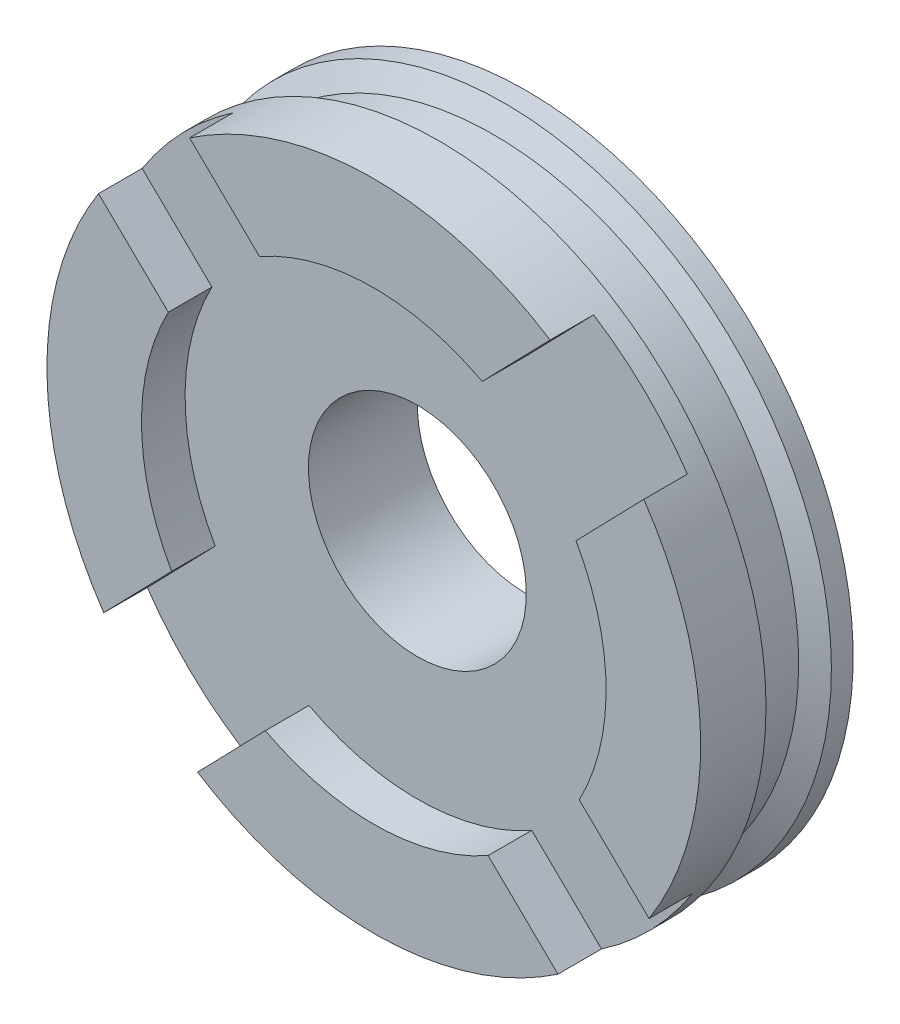
ISO-10303-21;
HEADER;
FILE_DESCRIPTION(('STEP AP214'),'2;1');
FILE_NAME('part.step','',(''),(''),'','','');
FILE_SCHEMA(('AUTOMOTIVE_DESIGN { 1 0 10303 214 1 1 1 1 }'));
ENDSEC;
DATA;
#1=APPLICATION_CONTEXT('core data for automotive mechanical design processes');
#2=APPLICATION_PROTOCOL_DEFINITION('international standard','automotive_design',2000,#1);
#3=PRODUCT_CONTEXT('',#1,'mechanical');
#4=PRODUCT('Part','Part','',(#3));
#5=PRODUCT_RELATED_PRODUCT_CATEGORY('part','',(#4));
#6=PRODUCT_DEFINITION_FORMATION('','',#4);
#7=PRODUCT_DEFINITION_CONTEXT('part definition',#1,'design');
#8=PRODUCT_DEFINITION('design','',#6,#7);
#9=PRODUCT_DEFINITION_SHAPE('','',#8);
#10=(LENGTH_UNIT() NAMED_UNIT(*) SI_UNIT(.MILLI.,.METRE.));
#11=(NAMED_UNIT(*) PLANE_ANGLE_UNIT() SI_UNIT($,.RADIAN.));
#12=(NAMED_UNIT(*) SI_UNIT($,.STERADIAN.) SOLID_ANGLE_UNIT());
#13=UNCERTAINTY_MEASURE_WITH_UNIT(LENGTH_MEASURE(1.E-05),#10,'distance_accuracy_value','');
#14=(GEOMETRIC_REPRESENTATION_CONTEXT(3) GLOBAL_UNCERTAINTY_ASSIGNED_CONTEXT((#13)) GLOBAL_UNIT_ASSIGNED_CONTEXT((#10,
#11,#12)) REPRESENTATION_CONTEXT('',''));
#15=CARTESIAN_POINT('',(0.,0.,0.));
#16=DIRECTION('',(0.,0.,1.));
#17=DIRECTION('',(1.,0.,0.));
#18=AXIS2_PLACEMENT_3D('',#15,#16,#17);
#19=CARTESIAN_POINT('',(60.,0.,20.));
#20=DIRECTION('',(0.,0.,1.));
#21=DIRECTION('',(0.717265531340079,-0.696799940837709,0.));
#22=AXIS2_PLACEMENT_3D('',#19,#20,#21);
#23=PLANE('',#22);
#24=CARTESIAN_POINT('',(60.,0.,20.));
#25=DIRECTION('',(0.,0.,1.));
#26=DIRECTION('',(0.717265531340079,-0.696799940837709,0.));
#27=AXIS2_PLACEMENT_3D('',#24,#25,#26);
#28=CIRCLE('',#27,5.);
#29=CARTESIAN_POINT('',(63.5863276567004,-3.48399970418854,20.));
#30=VERTEX_POINT('',#29);
#31=EDGE_CURVE('E280',#30,#30,#28,.T.);
#32=ORIENTED_EDGE('',*,*,#31,.F.);
#33=EDGE_LOOP('',(#32));
#34=FACE_BOUND('',#33,.T.);
#35=CARTESIAN_POINT('',(60.,0.,20.));
#36=DIRECTION('',(0.,0.,-1.));
#37=DIRECTION('',(0.717265531340079,-0.696799940837709,0.));
#38=AXIS2_PLACEMENT_3D('',#35,#36,#37);
#39=CIRCLE('',#38,10.6610669594002);
#40=CARTESIAN_POINT('',(50.7197544484852,-5.2474175759514,20.));
#41=VERTEX_POINT('',#40);
#42=CARTESIAN_POINT('',(50.5717827790223,4.97665236347435,20.));
#43=VERTEX_POINT('',#42);
#44=EDGE_CURVE('E55',#41,#43,#39,.T.);
#45=ORIENTED_EDGE('',*,*,#44,.F.);
#46=DIRECTION('',(0.696799940837709,0.717265531340079,0.));
#47=VECTOR('',#46,1.);
#48=CARTESIAN_POINT('',(47.6073775588564,-8.45120754870358,20.));
#49=LINE('',#48,#47);
#50=CARTESIAN_POINT('',(47.6073775588564,-8.45120754870358,20.));
#51=VERTEX_POINT('',#50);
#52=EDGE_CURVE('E321',#51,#41,#49,.T.);
#53=ORIENTED_EDGE('',*,*,#52,.F.);
#54=CARTESIAN_POINT('',(60.,0.,20.));
#55=DIRECTION('',(0.,0.,1.));
#56=DIRECTION('',(0.717265531340079,-0.696799940837709,0.));
#57=AXIS2_PLACEMENT_3D('',#54,#55,#56);
#58=CIRCLE('',#57,15.);
#59=CARTESIAN_POINT('',(51.9109707468969,-12.6320071937298,20.));
#60=VERTEX_POINT('',#59);
#61=EDGE_CURVE('E47',#51,#60,#58,.T.);
#62=ORIENTED_EDGE('',*,*,#61,.T.);
#63=DIRECTION('',(-0.696799940837709,-0.717265531340079,0.));
#64=VECTOR('',#63,1.);
#65=CARTESIAN_POINT('',(51.9109707468969,-12.6320071937298,20.));
#66=LINE('',#65,#64);
#67=CARTESIAN_POINT('',(55.0233476365256,-9.42821722097766,20.));
#68=VERTEX_POINT('',#67);
#69=EDGE_CURVE('E186',#68,#60,#66,.T.);
#70=ORIENTED_EDGE('',*,*,#69,.F.);
#71=CARTESIAN_POINT('',(60.,0.,20.));
#72=DIRECTION('',(0.,0.,-1.));
#73=DIRECTION('',(0.717265531340079,-0.696799940837709,0.));
#74=AXIS2_PLACEMENT_3D('',#71,#72,#73);
#75=CIRCLE('',#74,10.6610669594002);
#76=CARTESIAN_POINT('',(65.2474175759514,-9.28024555151483,20.));
#77=VERTEX_POINT('',#76);
#78=EDGE_CURVE('E176',#77,#68,#75,.T.);
#79=ORIENTED_EDGE('',*,*,#78,.F.);
#80=DIRECTION('',(-0.717265531340079,0.696799940837709,0.));
#81=VECTOR('',#80,1.);
#82=CARTESIAN_POINT('',(68.4512075487036,-12.3926224411436,20.));
#83=LINE('',#82,#81);
#84=CARTESIAN_POINT('',(68.4512075487036,-12.3926224411436,20.));
#85=VERTEX_POINT('',#84);
#86=EDGE_CURVE('E173',#85,#77,#83,.T.);
#87=ORIENTED_EDGE('',*,*,#86,.F.);
#88=CARTESIAN_POINT('',(72.6320071937298,-8.08902925310312,20.));
#89=VERTEX_POINT('',#88);
#90=EDGE_CURVE('E318',#85,#89,#58,.T.);
#91=ORIENTED_EDGE('',*,*,#90,.T.);
#92=DIRECTION('',(0.717265531340079,-0.696799940837709,0.));
#93=VECTOR('',#92,1.);
#94=CARTESIAN_POINT('',(72.6320071937298,-8.08902925310312,20.));
#95=LINE('',#94,#93);
#96=CARTESIAN_POINT('',(69.4282172209777,-4.97665236347436,20.));
#97=VERTEX_POINT('',#96);
#98=EDGE_CURVE('E212',#97,#89,#95,.T.);
#99=ORIENTED_EDGE('',*,*,#98,.F.);
#100=CARTESIAN_POINT('',(60.,0.,20.));
#101=DIRECTION('',(0.,0.,-1.));
#102=DIRECTION('',(0.717265531340079,-0.696799940837709,0.));
#103=AXIS2_PLACEMENT_3D('',#100,#101,#102);
#104=CIRCLE('',#103,10.6610669594002);
#105=CARTESIAN_POINT('',(69.2802455515148,5.2474175759514,20.));
#106=VERTEX_POINT('',#105);
#107=EDGE_CURVE('E221',#106,#97,#104,.T.);
#108=ORIENTED_EDGE('',*,*,#107,.F.);
#109=DIRECTION('',(-0.696799940837709,-0.717265531340079,0.));
#110=VECTOR('',#109,1.);
#111=CARTESIAN_POINT('',(72.3926224411436,8.45120754870358,20.));
#112=LINE('',#111,#110);
#113=CARTESIAN_POINT('',(72.3926224411436,8.45120754870358,20.));
#114=VERTEX_POINT('',#113);
#115=EDGE_CURVE('E207',#114,#106,#112,.T.);
#116=ORIENTED_EDGE('',*,*,#115,.F.);
#117=CARTESIAN_POINT('',(68.0890292531031,12.6320071937298,20.));
#118=VERTEX_POINT('',#117);
#119=EDGE_CURVE('E48',#114,#118,#58,.T.);
#120=ORIENTED_EDGE('',*,*,#119,.T.);
#121=DIRECTION('',(0.696799940837709,0.717265531340079,0.));
#122=VECTOR('',#121,1.);
#123=CARTESIAN_POINT('',(68.0890292531031,12.6320071937298,20.));
#124=LINE('',#123,#122);
#125=CARTESIAN_POINT('',(64.9766523634744,9.42821722097765,20.));
#126=VERTEX_POINT('',#125);
#127=EDGE_CURVE('E242',#126,#118,#124,.T.);
#128=ORIENTED_EDGE('',*,*,#127,.F.);
#129=CARTESIAN_POINT('',(60.,0.,20.));
#130=DIRECTION('',(0.,0.,-1.));
#131=DIRECTION('',(0.717265531340079,-0.696799940837709,0.));
#132=AXIS2_PLACEMENT_3D('',#129,#130,#131);
#133=CIRCLE('',#132,10.6610669594002);
#134=CARTESIAN_POINT('',(54.7525824240486,9.28024555151483,20.));
#135=VERTEX_POINT('',#134);
#136=EDGE_CURVE('E251',#135,#126,#133,.T.);
#137=ORIENTED_EDGE('',*,*,#136,.F.);
#138=DIRECTION('',(0.717265531340079,-0.696799940837709,0.));
#139=VECTOR('',#138,1.);
#140=CARTESIAN_POINT('',(51.5487924512964,12.3926224411436,20.));
#141=LINE('',#140,#139);
#142=CARTESIAN_POINT('',(51.5487924512964,12.3926224411436,20.));
#143=VERTEX_POINT('',#142);
#144=EDGE_CURVE('E237',#143,#135,#141,.T.);
#145=ORIENTED_EDGE('',*,*,#144,.F.);
#146=CARTESIAN_POINT('',(47.3679928062702,8.08902925310312,20.));
#147=VERTEX_POINT('',#146);
#148=EDGE_CURVE('E11',#143,#147,#58,.T.);
#149=ORIENTED_EDGE('',*,*,#148,.T.);
#150=DIRECTION('',(-0.717265531340079,0.696799940837708,0.));
#151=VECTOR('',#150,1.);
#152=CARTESIAN_POINT('',(47.3679928062702,8.08902925310312,20.));
#153=LINE('',#152,#151);
#154=EDGE_CURVE('E59',#43,#147,#153,.T.);
#155=ORIENTED_EDGE('',*,*,#154,.F.);
#156=EDGE_LOOP('',(#45,#53,#62,#70,#79,#87,#91,#99,#108,#116,#120,#128,#137,#145,#149,#155));
#157=FACE_BOUND('',#156,.T.);
#158=ADVANCED_FACE('F38',(#34,#157),#23,.T.);
#159=CARTESIAN_POINT('',(60.,0.,20.));
#160=DIRECTION('',(0.,0.,-1.));
#161=DIRECTION('',(-0.717265531340079,0.696799940837709,0.));
#162=AXIS2_PLACEMENT_3D('',#159,#160,#161);
#163=CYLINDRICAL_SURFACE('',#162,15.);
#164=CARTESIAN_POINT('',(60.,0.,16.));
#165=DIRECTION('',(0.,0.,-1.));
#166=DIRECTION('',(-0.717265531340079,0.696799940837709,0.));
#167=AXIS2_PLACEMENT_3D('',#164,#165,#166);
#168=CIRCLE('',#167,15.);
#169=CARTESIAN_POINT('',(49.2410170298988,10.4519991125656,16.));
#170=VERTEX_POINT('',#169);
#171=EDGE_CURVE('E276',#170,#170,#168,.T.);
#172=ORIENTED_EDGE('',*,*,#171,.T.);
#173=EDGE_LOOP('',(#172));
#174=FACE_BOUND('',#173,.T.);
#175=CARTESIAN_POINT('',(60.,0.,15.));
#176=DIRECTION('',(0.,0.,1.));
#177=DIRECTION('',(0.717265531340079,-0.696799940837709,0.));
#178=AXIS2_PLACEMENT_3D('',#175,#176,#177);
#179=CIRCLE('',#178,15.);
#180=CARTESIAN_POINT('',(70.7589829701012,-10.4519991125656,15.));
#181=VERTEX_POINT('',#180);
#182=EDGE_CURVE('E42',#181,#181,#179,.T.);
#183=ORIENTED_EDGE('',*,*,#182,.T.);
#184=EDGE_LOOP('',(#183));
#185=FACE_BOUND('',#184,.T.);
#186=ADVANCED_FACE('F301',(#174,#185),#163,.T.);
#187=CARTESIAN_POINT('',(60.,0.,15.));
#188=DIRECTION('',(0.,0.,1.));
#189=DIRECTION('',(0.717265531340079,-0.696799940837709,0.));
#190=AXIS2_PLACEMENT_3D('',#187,#188,#189);
#191=PLANE('',#190);
#192=ORIENTED_EDGE('',*,*,#182,.F.);
#193=EDGE_LOOP('',(#192));
#194=FACE_BOUND('',#193,.T.);
#195=CARTESIAN_POINT('',(60.,0.,15.));
#196=DIRECTION('',(0.,0.,1.));
#197=DIRECTION('',(0.717265531340079,-0.696799940837709,0.));
#198=AXIS2_PLACEMENT_3D('',#195,#196,#197);
#199=CIRCLE('',#198,5.);
#200=CARTESIAN_POINT('',(63.5863276567004,-3.48399970418854,15.));
#201=VERTEX_POINT('',#200);
#202=EDGE_CURVE('E279',#201,#201,#199,.T.);
#203=ORIENTED_EDGE('',*,*,#202,.T.);
#204=EDGE_LOOP('',(#203));
#205=FACE_BOUND('',#204,.T.);
#206=ADVANCED_FACE('F286',(#194,#205),#191,.F.);
#207=CARTESIAN_POINT('',(60.,0.,19.));
#208=DIRECTION('',(0.,0.,-1.));
#209=DIRECTION('',(-0.717265531340079,0.696799940837709,0.));
#210=AXIS2_PLACEMENT_3D('',#207,#208,#209);
#211=CIRCLE('',#210,15.);
#212=CARTESIAN_POINT('',(49.2410170298988,10.4519991125656,19.));
#213=VERTEX_POINT('',#212);
#214=EDGE_CURVE('E267',#213,#213,#211,.T.);
#215=ORIENTED_EDGE('',*,*,#214,.F.);
#216=EDGE_LOOP('',(#215));
#217=FACE_BOUND('',#216,.T.);
#218=ORIENTED_EDGE('',*,*,#148,.F.);
#219=DIRECTION('',(0.,0.,-1.));
#220=VECTOR('',#219,1.);
#221=CARTESIAN_POINT('',(51.5487924512964,12.3926224411436,22.));
#222=LINE('',#221,#220);
#223=CARTESIAN_POINT('',(51.5487924512964,12.3926224411436,22.));
#224=VERTEX_POINT('',#223);
#225=EDGE_CURVE('E264',#224,#143,#222,.T.);
#226=ORIENTED_EDGE('',*,*,#225,.F.);
#227=CARTESIAN_POINT('',(60.,0.,22.));
#228=DIRECTION('',(0.,0.,1.));
#229=DIRECTION('',(0.717265531340079,-0.696799940837709,0.));
#230=AXIS2_PLACEMENT_3D('',#227,#228,#229);
#231=CIRCLE('',#230,15.);
#232=CARTESIAN_POINT('',(68.0890292531031,12.6320071937298,22.));
#233=VERTEX_POINT('',#232);
#234=EDGE_CURVE('E238',#233,#224,#231,.T.);
#235=ORIENTED_EDGE('',*,*,#234,.F.);
#236=DIRECTION('',(0.,0.,-1.));
#237=VECTOR('',#236,1.);
#238=CARTESIAN_POINT('',(68.0890292531031,12.6320071937298,22.));
#239=LINE('',#238,#237);
#240=EDGE_CURVE('E248',#233,#118,#239,.T.);
#241=ORIENTED_EDGE('',*,*,#240,.T.);
#242=ORIENTED_EDGE('',*,*,#119,.F.);
#243=DIRECTION('',(0.,0.,-1.));
#244=VECTOR('',#243,1.);
#245=CARTESIAN_POINT('',(72.3926224411436,8.45120754870358,22.));
#246=LINE('',#245,#244);
#247=CARTESIAN_POINT('',(72.3926224411436,8.45120754870358,22.));
#248=VERTEX_POINT('',#247);
#249=EDGE_CURVE('E234',#248,#114,#246,.T.);
#250=ORIENTED_EDGE('',*,*,#249,.F.);
#251=CARTESIAN_POINT('',(60.,0.,22.));
#252=DIRECTION('',(0.,0.,1.));
#253=DIRECTION('',(0.717265531340079,-0.696799940837709,0.));
#254=AXIS2_PLACEMENT_3D('',#251,#252,#253);
#255=CIRCLE('',#254,15.);
#256=CARTESIAN_POINT('',(72.6320071937298,-8.08902925310312,22.));
#257=VERTEX_POINT('',#256);
#258=EDGE_CURVE('E208',#257,#248,#255,.T.);
#259=ORIENTED_EDGE('',*,*,#258,.F.);
#260=DIRECTION('',(0.,0.,-1.));
#261=VECTOR('',#260,1.);
#262=CARTESIAN_POINT('',(72.6320071937298,-8.08902925310312,22.));
#263=LINE('',#262,#261);
#264=EDGE_CURVE('E218',#257,#89,#263,.T.);
#265=ORIENTED_EDGE('',*,*,#264,.T.);
#266=ORIENTED_EDGE('',*,*,#90,.F.);
#267=DIRECTION('',(0.,0.,-1.));
#268=VECTOR('',#267,1.);
#269=CARTESIAN_POINT('',(68.4512075487036,-12.3926224411436,22.));
#270=LINE('',#269,#268);
#271=CARTESIAN_POINT('',(68.4512075487036,-12.3926224411436,22.));
#272=VERTEX_POINT('',#271);
#273=EDGE_CURVE('E204',#272,#85,#270,.T.);
#274=ORIENTED_EDGE('',*,*,#273,.F.);
#275=CARTESIAN_POINT('',(60.,0.,22.));
#276=DIRECTION('',(0.,0.,1.));
#277=DIRECTION('',(0.717265531340079,-0.696799940837709,0.));
#278=AXIS2_PLACEMENT_3D('',#275,#276,#277);
#279=CIRCLE('',#278,15.);
#280=CARTESIAN_POINT('',(51.9109707468969,-12.6320071937298,22.));
#281=VERTEX_POINT('',#280);
#282=EDGE_CURVE('E182',#281,#272,#279,.T.);
#283=ORIENTED_EDGE('',*,*,#282,.F.);
#284=DIRECTION('',(0.,0.,-1.));
#285=VECTOR('',#284,1.);
#286=CARTESIAN_POINT('',(51.9109707468969,-12.6320071937298,22.));
#287=LINE('',#286,#285);
#288=EDGE_CURVE('E191',#281,#60,#287,.T.);
#289=ORIENTED_EDGE('',*,*,#288,.T.);
#290=ORIENTED_EDGE('',*,*,#61,.F.);
#291=DIRECTION('',(0.,0.,-1.));
#292=VECTOR('',#291,1.);
#293=CARTESIAN_POINT('',(47.6073775588564,-8.45120754870358,22.));
#294=LINE('',#293,#292);
#295=CARTESIAN_POINT('',(47.6073775588564,-8.45120754870358,22.));
#296=VERTEX_POINT('',#295);
#297=EDGE_CURVE('E155',#296,#51,#294,.T.);
#298=ORIENTED_EDGE('',*,*,#297,.F.);
#299=CARTESIAN_POINT('',(60.,0.,22.));
#300=DIRECTION('',(0.,0.,1.));
#301=DIRECTION('',(0.717265531340079,-0.696799940837709,0.));
#302=AXIS2_PLACEMENT_3D('',#299,#300,#301);
#303=CIRCLE('',#302,15.);
#304=CARTESIAN_POINT('',(47.3679928062702,8.08902925310312,22.));
#305=VERTEX_POINT('',#304);
#306=EDGE_CURVE('E161',#305,#296,#303,.T.);
#307=ORIENTED_EDGE('',*,*,#306,.F.);
#308=DIRECTION('',(0.,0.,-1.));
#309=VECTOR('',#308,1.);
#310=CARTESIAN_POINT('',(47.3679928062702,8.08902925310312,22.));
#311=LINE('',#310,#309);
#312=EDGE_CURVE('E588',#305,#147,#311,.T.);
#313=ORIENTED_EDGE('',*,*,#312,.T.);
#314=EDGE_LOOP('',(#218,#226,#235,#241,#242,#250,#259,#265,#266,#274,#283,#289,#290,#298,#307,#313));
#315=FACE_BOUND('',#314,.T.);
#316=ADVANCED_FACE('F40',(#217,#315),#163,.T.);
#317=CARTESIAN_POINT('',(60.,0.,20.));
#318=DIRECTION('',(0.,0.,-1.));
#319=DIRECTION('',(-0.717265531340079,0.696799940837709,0.));
#320=AXIS2_PLACEMENT_3D('',#317,#318,#319);
#321=CYLINDRICAL_SURFACE('',#320,5.);
#322=ORIENTED_EDGE('',*,*,#31,.T.);
#323=EDGE_LOOP('',(#322));
#324=FACE_BOUND('',#323,.T.);
#325=ORIENTED_EDGE('',*,*,#202,.F.);
#326=EDGE_LOOP('',(#325));
#327=FACE_BOUND('',#326,.T.);
#328=ADVANCED_FACE('F288',(#324,#327),#321,.F.);
#329=CARTESIAN_POINT('',(60.,0.,16.5));
#330=DIRECTION('',(0.,0.,-1.));
#331=DIRECTION('',(-0.717265531340079,0.696799940837709,0.));
#332=AXIS2_PLACEMENT_3D('',#329,#330,#331);
#333=CONICAL_SURFACE('',#332,14.,1.10714871779409);
#334=ORIENTED_EDGE('',*,*,#171,.F.);
#335=EDGE_LOOP('',(#334));
#336=FACE_BOUND('',#335,.T.);
#337=CARTESIAN_POINT('',(60.,0.,16.5));
#338=DIRECTION('',(0.,0.,-1.));
#339=DIRECTION('',(-0.717265531340079,0.696799940837709,0.));
#340=AXIS2_PLACEMENT_3D('',#337,#338,#339);
#341=CIRCLE('',#340,14.);
#342=CARTESIAN_POINT('',(49.9582825612389,9.75519917172792,16.5));
#343=VERTEX_POINT('',#342);
#344=EDGE_CURVE('E273',#343,#343,#341,.T.);
#345=ORIENTED_EDGE('',*,*,#344,.T.);
#346=EDGE_LOOP('',(#345));
#347=FACE_BOUND('',#346,.T.);
#348=ADVANCED_FACE('F290',(#336,#347),#333,.T.);
#349=CARTESIAN_POINT('',(60.,0.,15.));
#350=DIRECTION('',(0.,0.,-1.));
#351=DIRECTION('',(-0.717265531340079,0.696799940837709,0.));
#352=AXIS2_PLACEMENT_3D('',#349,#350,#351);
#353=CYLINDRICAL_SURFACE('',#352,14.);
#354=ORIENTED_EDGE('',*,*,#344,.F.);
#355=EDGE_LOOP('',(#354));
#356=FACE_BOUND('',#355,.T.);
#357=CARTESIAN_POINT('',(60.,0.,18.5));
#358=DIRECTION('',(0.,0.,-1.));
#359=DIRECTION('',(-0.717265531340079,0.696799940837709,0.));
#360=AXIS2_PLACEMENT_3D('',#357,#358,#359);
#361=CIRCLE('',#360,14.);
#362=CARTESIAN_POINT('',(49.9582825612389,9.75519917172792,18.5));
#363=VERTEX_POINT('',#362);
#364=EDGE_CURVE('E270',#363,#363,#361,.T.);
#365=ORIENTED_EDGE('',*,*,#364,.T.);
#366=EDGE_LOOP('',(#365));
#367=FACE_BOUND('',#366,.T.);
#368=ADVANCED_FACE('F296',(#356,#367),#353,.T.);
#369=CARTESIAN_POINT('',(60.,0.,19.));
#370=DIRECTION('',(0.,0.,1.));
#371=DIRECTION('',(0.717265531340079,-0.696799940837709,0.));
#372=AXIS2_PLACEMENT_3D('',#369,#370,#371);
#373=CONICAL_SURFACE('',#372,15.,1.10714871779409);
#374=ORIENTED_EDGE('',*,*,#364,.F.);
#375=EDGE_LOOP('',(#374));
#376=FACE_BOUND('',#375,.T.);
#377=ORIENTED_EDGE('',*,*,#214,.T.);
#378=EDGE_LOOP('',(#377));
#379=FACE_BOUND('',#378,.T.);
#380=ADVANCED_FACE('F375',(#376,#379),#373,.T.);
#381=CARTESIAN_POINT('',(51.5487924512964,12.3926224411436,22.));
#382=DIRECTION('',(0.696799940837709,0.717265531340079,0.));
#383=DIRECTION('',(-0.717265531340079,0.696799940837709,0.));
#384=AXIS2_PLACEMENT_3D('',#381,#382,#383);
#385=PLANE('',#384);
#386=ORIENTED_EDGE('',*,*,#144,.T.);
#387=DIRECTION('',(0.,0.,-1.));
#388=VECTOR('',#387,1.);
#389=CARTESIAN_POINT('',(54.7525824240486,9.28024555151483,22.));
#390=LINE('',#389,#388);
#391=CARTESIAN_POINT('',(54.7525824240486,9.28024555151483,22.));
#392=VERTEX_POINT('',#391);
#393=EDGE_CURVE('E261',#392,#135,#390,.T.);
#394=ORIENTED_EDGE('',*,*,#393,.F.);
#395=DIRECTION('',(0.717265531340079,-0.696799940837709,0.));
#396=VECTOR('',#395,1.);
#397=CARTESIAN_POINT('',(51.5487924512964,12.3926224411436,22.));
#398=LINE('',#397,#396);
#399=EDGE_CURVE('E241',#224,#392,#398,.T.);
#400=ORIENTED_EDGE('',*,*,#399,.F.);
#401=ORIENTED_EDGE('',*,*,#225,.T.);
#402=EDGE_LOOP('',(#386,#394,#400,#401));
#403=FACE_BOUND('',#402,.T.);
#404=ADVANCED_FACE('F371',(#403),#385,.F.);
#405=CARTESIAN_POINT('',(60.,0.,22.));
#406=DIRECTION('',(0.,0.,-1.));
#407=DIRECTION('',(-0.717265531340079,0.696799940837709,0.));
#408=AXIS2_PLACEMENT_3D('',#405,#406,#407);
#409=CYLINDRICAL_SURFACE('',#408,10.6610669594002);
#410=ORIENTED_EDGE('',*,*,#136,.T.);
#411=DIRECTION('',(0.,0.,-1.));
#412=VECTOR('',#411,1.);
#413=CARTESIAN_POINT('',(64.9766523634744,9.42821722097765,22.));
#414=LINE('',#413,#412);
#415=CARTESIAN_POINT('',(64.9766523634744,9.42821722097765,22.));
#416=VERTEX_POINT('',#415);
#417=EDGE_CURVE('E258',#416,#126,#414,.T.);
#418=ORIENTED_EDGE('',*,*,#417,.F.);
#419=CARTESIAN_POINT('',(60.,0.,22.));
#420=DIRECTION('',(0.,0.,-1.));
#421=DIRECTION('',(0.717265531340079,-0.696799940837709,0.));
#422=AXIS2_PLACEMENT_3D('',#419,#420,#421);
#423=CIRCLE('',#422,10.6610669594002);
#424=EDGE_CURVE('E244',#392,#416,#423,.T.);
#425=ORIENTED_EDGE('',*,*,#424,.F.);
#426=ORIENTED_EDGE('',*,*,#393,.T.);
#427=EDGE_LOOP('',(#410,#418,#425,#426));
#428=FACE_BOUND('',#427,.T.);
#429=ADVANCED_FACE('F367',(#428),#409,.F.);
#430=CARTESIAN_POINT('',(68.0890292531031,12.6320071937298,22.));
#431=DIRECTION('',(-0.717265531340079,0.696799940837709,0.));
#432=DIRECTION('',(0.,0.,1.));
#433=AXIS2_PLACEMENT_3D('',#430,#431,#432);
#434=PLANE('',#433);
#435=ORIENTED_EDGE('',*,*,#127,.T.);
#436=ORIENTED_EDGE('',*,*,#240,.F.);
#437=DIRECTION('',(0.696799940837709,0.717265531340079,0.));
#438=VECTOR('',#437,1.);
#439=CARTESIAN_POINT('',(68.0890292531031,12.6320071937298,22.));
#440=LINE('',#439,#438);
#441=EDGE_CURVE('E246',#416,#233,#440,.T.);
#442=ORIENTED_EDGE('',*,*,#441,.F.);
#443=ORIENTED_EDGE('',*,*,#417,.T.);
#444=EDGE_LOOP('',(#435,#436,#442,#443));
#445=FACE_BOUND('',#444,.T.);
#446=ADVANCED_FACE('F363',(#445),#434,.F.);
#447=CARTESIAN_POINT('',(60.,0.,22.));
#448=DIRECTION('',(0.,0.,1.));
#449=DIRECTION('',(0.717265531340079,-0.696799940837709,0.));
#450=AXIS2_PLACEMENT_3D('',#447,#448,#449);
#451=PLANE('',#450);
#452=ORIENTED_EDGE('',*,*,#234,.T.);
#453=ORIENTED_EDGE('',*,*,#399,.T.);
#454=ORIENTED_EDGE('',*,*,#424,.T.);
#455=ORIENTED_EDGE('',*,*,#441,.T.);
#456=EDGE_LOOP('',(#452,#453,#454,#455));
#457=FACE_BOUND('',#456,.T.);
#458=ADVANCED_FACE('F359',(#457),#451,.T.);
#459=CARTESIAN_POINT('',(72.3926224411436,8.45120754870358,22.));
#460=DIRECTION('',(0.717265531340079,-0.696799940837709,0.));
#461=DIRECTION('',(0.696799940837709,0.717265531340079,0.));
#462=AXIS2_PLACEMENT_3D('',#459,#460,#461);
#463=PLANE('',#462);
#464=ORIENTED_EDGE('',*,*,#115,.T.);
#465=DIRECTION('',(0.,0.,-1.));
#466=VECTOR('',#465,1.);
#467=CARTESIAN_POINT('',(69.2802455515148,5.2474175759514,22.));
#468=LINE('',#467,#466);
#469=CARTESIAN_POINT('',(69.2802455515148,5.2474175759514,22.));
#470=VERTEX_POINT('',#469);
#471=EDGE_CURVE('E231',#470,#106,#468,.T.);
#472=ORIENTED_EDGE('',*,*,#471,.F.);
#473=DIRECTION('',(-0.696799940837709,-0.717265531340079,0.));
#474=VECTOR('',#473,1.);
#475=CARTESIAN_POINT('',(72.3926224411436,8.45120754870358,22.));
#476=LINE('',#475,#474);
#477=EDGE_CURVE('E211',#248,#470,#476,.T.);
#478=ORIENTED_EDGE('',*,*,#477,.F.);
#479=ORIENTED_EDGE('',*,*,#249,.T.);
#480=EDGE_LOOP('',(#464,#472,#478,#479));
#481=FACE_BOUND('',#480,.T.);
#482=ADVANCED_FACE('F355',(#481),#463,.F.);
#483=CARTESIAN_POINT('',(60.,0.,22.));
#484=DIRECTION('',(0.,0.,-1.));
#485=DIRECTION('',(-0.717265531340079,0.696799940837709,0.));
#486=AXIS2_PLACEMENT_3D('',#483,#484,#485);
#487=CYLINDRICAL_SURFACE('',#486,10.6610669594002);
#488=ORIENTED_EDGE('',*,*,#107,.T.);
#489=DIRECTION('',(0.,0.,-1.));
#490=VECTOR('',#489,1.);
#491=CARTESIAN_POINT('',(69.4282172209777,-4.97665236347435,22.));
#492=LINE('',#491,#490);
#493=CARTESIAN_POINT('',(69.4282172209777,-4.97665236347435,22.));
#494=VERTEX_POINT('',#493);
#495=EDGE_CURVE('E228',#494,#97,#492,.T.);
#496=ORIENTED_EDGE('',*,*,#495,.F.);
#497=CARTESIAN_POINT('',(60.,0.,22.));
#498=DIRECTION('',(0.,0.,-1.));
#499=DIRECTION('',(0.717265531340079,-0.696799940837709,0.));
#500=AXIS2_PLACEMENT_3D('',#497,#498,#499);
#501=CIRCLE('',#500,10.6610669594002);
#502=EDGE_CURVE('E214',#470,#494,#501,.T.);
#503=ORIENTED_EDGE('',*,*,#502,.F.);
#504=ORIENTED_EDGE('',*,*,#471,.T.);
#505=EDGE_LOOP('',(#488,#496,#503,#504));
#506=FACE_BOUND('',#505,.T.);
#507=ADVANCED_FACE('F351',(#506),#487,.F.);
#508=CARTESIAN_POINT('',(72.6320071937298,-8.08902925310312,22.));
#509=DIRECTION('',(0.696799940837709,0.717265531340079,0.));
#510=DIRECTION('',(-0.717265531340079,0.696799940837709,0.));
#511=AXIS2_PLACEMENT_3D('',#508,#509,#510);
#512=PLANE('',#511);
#513=ORIENTED_EDGE('',*,*,#98,.T.);
#514=ORIENTED_EDGE('',*,*,#264,.F.);
#515=DIRECTION('',(0.717265531340079,-0.696799940837709,0.));
#516=VECTOR('',#515,1.);
#517=CARTESIAN_POINT('',(72.6320071937298,-8.08902925310312,22.));
#518=LINE('',#517,#516);
#519=EDGE_CURVE('E216',#494,#257,#518,.T.);
#520=ORIENTED_EDGE('',*,*,#519,.F.);
#521=ORIENTED_EDGE('',*,*,#495,.T.);
#522=EDGE_LOOP('',(#513,#514,#520,#521));
#523=FACE_BOUND('',#522,.T.);
#524=ADVANCED_FACE('F344',(#523),#512,.F.);
#525=CARTESIAN_POINT('',(60.,0.,22.));
#526=DIRECTION('',(0.,0.,1.));
#527=DIRECTION('',(0.717265531340079,-0.696799940837709,0.));
#528=AXIS2_PLACEMENT_3D('',#525,#526,#527);
#529=PLANE('',#528);
#530=ORIENTED_EDGE('',*,*,#258,.T.);
#531=ORIENTED_EDGE('',*,*,#477,.T.);
#532=ORIENTED_EDGE('',*,*,#502,.T.);
#533=ORIENTED_EDGE('',*,*,#519,.T.);
#534=EDGE_LOOP('',(#530,#531,#532,#533));
#535=FACE_BOUND('',#534,.T.);
#536=ADVANCED_FACE('F337',(#535),#529,.T.);
#537=CARTESIAN_POINT('',(68.4512075487036,-12.3926224411436,22.));
#538=DIRECTION('',(-0.696799940837709,-0.717265531340079,0.));
#539=DIRECTION('',(0.717265531340079,-0.696799940837709,0.));
#540=AXIS2_PLACEMENT_3D('',#537,#538,#539);
#541=PLANE('',#540);
#542=ORIENTED_EDGE('',*,*,#86,.T.);
#543=DIRECTION('',(0.,0.,-1.));
#544=VECTOR('',#543,1.);
#545=CARTESIAN_POINT('',(65.2474175759514,-9.28024555151483,22.));
#546=LINE('',#545,#544);
#547=CARTESIAN_POINT('',(65.2474175759514,-9.28024555151483,22.));
#548=VERTEX_POINT('',#547);
#549=EDGE_CURVE('E201',#548,#77,#546,.T.);
#550=ORIENTED_EDGE('',*,*,#549,.F.);
#551=DIRECTION('',(-0.717265531340079,0.696799940837709,0.));
#552=VECTOR('',#551,1.);
#553=CARTESIAN_POINT('',(68.4512075487036,-12.3926224411436,22.));
#554=LINE('',#553,#552);
#555=EDGE_CURVE('E185',#272,#548,#554,.T.);
#556=ORIENTED_EDGE('',*,*,#555,.F.);
#557=ORIENTED_EDGE('',*,*,#273,.T.);
#558=EDGE_LOOP('',(#542,#550,#556,#557));
#559=FACE_BOUND('',#558,.T.);
#560=ADVANCED_FACE('F336',(#559),#541,.F.);
#561=CARTESIAN_POINT('',(60.,0.,22.));
#562=DIRECTION('',(0.,0.,-1.));
#563=DIRECTION('',(-0.717265531340079,0.696799940837709,0.));
#564=AXIS2_PLACEMENT_3D('',#561,#562,#563);
#565=CYLINDRICAL_SURFACE('',#564,10.6610669594002);
#566=ORIENTED_EDGE('',*,*,#78,.T.);
#567=DIRECTION('',(0.,0.,-1.));
#568=VECTOR('',#567,1.);
#569=CARTESIAN_POINT('',(55.0233476365256,-9.42821722097765,22.));
#570=LINE('',#569,#568);
#571=CARTESIAN_POINT('',(55.0233476365256,-9.42821722097765,22.));
#572=VERTEX_POINT('',#571);
#573=EDGE_CURVE('E198',#572,#68,#570,.T.);
#574=ORIENTED_EDGE('',*,*,#573,.F.);
#575=CARTESIAN_POINT('',(60.,0.,22.));
#576=DIRECTION('',(0.,0.,-1.));
#577=DIRECTION('',(0.717265531340079,-0.696799940837709,0.));
#578=AXIS2_PLACEMENT_3D('',#575,#576,#577);
#579=CIRCLE('',#578,10.6610669594002);
#580=EDGE_CURVE('E188',#548,#572,#579,.T.);
#581=ORIENTED_EDGE('',*,*,#580,.F.);
#582=ORIENTED_EDGE('',*,*,#549,.T.);
#583=EDGE_LOOP('',(#566,#574,#581,#582));
#584=FACE_BOUND('',#583,.T.);
#585=ADVANCED_FACE('F334',(#584),#565,.F.);
#586=CARTESIAN_POINT('',(51.9109707468969,-12.6320071937298,22.));
#587=DIRECTION('',(0.717265531340079,-0.696799940837709,0.));
#588=DIRECTION('',(0.696799940837709,0.717265531340079,0.));
#589=AXIS2_PLACEMENT_3D('',#586,#587,#588);
#590=PLANE('',#589);
#591=ORIENTED_EDGE('',*,*,#69,.T.);
#592=ORIENTED_EDGE('',*,*,#288,.F.);
#593=DIRECTION('',(-0.696799940837709,-0.717265531340079,0.));
#594=VECTOR('',#593,1.);
#595=CARTESIAN_POINT('',(51.9109707468969,-12.6320071937298,22.));
#596=LINE('',#595,#594);
#597=EDGE_CURVE('E190',#572,#281,#596,.T.);
#598=ORIENTED_EDGE('',*,*,#597,.F.);
#599=ORIENTED_EDGE('',*,*,#573,.T.);
#600=EDGE_LOOP('',(#591,#592,#598,#599));
#601=FACE_BOUND('',#600,.T.);
#602=ADVANCED_FACE('F324',(#601),#590,.F.);
#603=CARTESIAN_POINT('',(60.,0.,22.));
#604=DIRECTION('',(0.,0.,1.));
#605=DIRECTION('',(0.717265531340079,-0.696799940837709,0.));
#606=AXIS2_PLACEMENT_3D('',#603,#604,#605);
#607=PLANE('',#606);
#608=ORIENTED_EDGE('',*,*,#282,.T.);
#609=ORIENTED_EDGE('',*,*,#555,.T.);
#610=ORIENTED_EDGE('',*,*,#580,.T.);
#611=ORIENTED_EDGE('',*,*,#597,.T.);
#612=EDGE_LOOP('',(#608,#609,#610,#611));
#613=FACE_BOUND('',#612,.T.);
#614=ADVANCED_FACE('F330',(#613),#607,.T.);
#615=CARTESIAN_POINT('',(47.6073775588564,-8.45120754870358,22.));
#616=DIRECTION('',(-0.717265531340079,0.696799940837709,0.));
#617=DIRECTION('',(-0.696799940837709,-0.717265531340079,0.));
#618=AXIS2_PLACEMENT_3D('',#615,#616,#617);
#619=PLANE('',#618);
#620=ORIENTED_EDGE('',*,*,#52,.T.);
#621=DIRECTION('',(0.,0.,-1.));
#622=VECTOR('',#621,1.);
#623=CARTESIAN_POINT('',(50.7197544484852,-5.2474175759514,22.));
#624=LINE('',#623,#622);
#625=CARTESIAN_POINT('',(50.7197544484852,-5.2474175759514,22.));
#626=VERTEX_POINT('',#625);
#627=EDGE_CURVE('E157',#626,#41,#624,.T.);
#628=ORIENTED_EDGE('',*,*,#627,.F.);
#629=DIRECTION('',(0.696799940837709,0.717265531340079,0.));
#630=VECTOR('',#629,1.);
#631=CARTESIAN_POINT('',(47.6073775588564,-8.45120754870358,22.));
#632=LINE('',#631,#630);
#633=EDGE_CURVE('E151',#296,#626,#632,.T.);
#634=ORIENTED_EDGE('',*,*,#633,.F.);
#635=ORIENTED_EDGE('',*,*,#297,.T.);
#636=EDGE_LOOP('',(#620,#628,#634,#635));
#637=FACE_BOUND('',#636,.T.);
#638=ADVANCED_FACE('F153',(#637),#619,.F.);
#639=CARTESIAN_POINT('',(60.,0.,22.));
#640=DIRECTION('',(0.,0.,-1.));
#641=DIRECTION('',(-0.717265531340079,0.696799940837709,0.));
#642=AXIS2_PLACEMENT_3D('',#639,#640,#641);
#643=CYLINDRICAL_SURFACE('',#642,10.6610669594002);
#644=ORIENTED_EDGE('',*,*,#44,.T.);
#645=DIRECTION('',(0.,0.,-1.));
#646=VECTOR('',#645,1.);
#647=CARTESIAN_POINT('',(50.5717827790223,4.97665236347436,22.));
#648=LINE('',#647,#646);
#649=CARTESIAN_POINT('',(50.5717827790223,4.97665236347436,22.));
#650=VERTEX_POINT('',#649);
#651=EDGE_CURVE('E178',#650,#43,#648,.T.);
#652=ORIENTED_EDGE('',*,*,#651,.F.);
#653=CARTESIAN_POINT('',(60.,0.,22.));
#654=DIRECTION('',(0.,0.,-1.));
#655=DIRECTION('',(0.717265531340079,-0.696799940837709,0.));
#656=AXIS2_PLACEMENT_3D('',#653,#654,#655);
#657=CIRCLE('',#656,10.6610669594002);
#658=EDGE_CURVE('E160',#626,#650,#657,.T.);
#659=ORIENTED_EDGE('',*,*,#658,.F.);
#660=ORIENTED_EDGE('',*,*,#627,.T.);
#661=EDGE_LOOP('',(#644,#652,#659,#660));
#662=FACE_BOUND('',#661,.T.);
#663=ADVANCED_FACE('F460',(#662),#643,.F.);
#664=CARTESIAN_POINT('',(47.3679928062702,8.08902925310312,22.));
#665=DIRECTION('',(-0.696799940837708,-0.717265531340079,0.));
#666=DIRECTION('',(0.717265531340079,-0.696799940837708,0.));
#667=AXIS2_PLACEMENT_3D('',#664,#665,#666);
#668=PLANE('',#667);
#669=ORIENTED_EDGE('',*,*,#154,.T.);
#670=ORIENTED_EDGE('',*,*,#312,.F.);
#671=DIRECTION('',(-0.717265531340079,0.696799940837708,0.));
#672=VECTOR('',#671,1.);
#673=CARTESIAN_POINT('',(47.3679928062702,8.08902925310312,22.));
#674=LINE('',#673,#672);
#675=EDGE_CURVE('E166',#650,#305,#674,.T.);
#676=ORIENTED_EDGE('',*,*,#675,.F.);
#677=ORIENTED_EDGE('',*,*,#651,.T.);
#678=EDGE_LOOP('',(#669,#670,#676,#677));
#679=FACE_BOUND('',#678,.T.);
#680=ADVANCED_FACE('F470',(#679),#668,.F.);
#681=CARTESIAN_POINT('',(60.,0.,22.));
#682=DIRECTION('',(0.,0.,1.));
#683=DIRECTION('',(0.717265531340079,-0.696799940837709,0.));
#684=AXIS2_PLACEMENT_3D('',#681,#682,#683);
#685=PLANE('',#684);
#686=ORIENTED_EDGE('',*,*,#306,.T.);
#687=ORIENTED_EDGE('',*,*,#633,.T.);
#688=ORIENTED_EDGE('',*,*,#658,.T.);
#689=ORIENTED_EDGE('',*,*,#675,.T.);
#690=EDGE_LOOP('',(#686,#687,#688,#689));
#691=FACE_BOUND('',#690,.T.);
#692=ADVANCED_FACE('F164',(#691),#685,.T.);
#693=CLOSED_SHELL('',(#158,#186,#206,#316,#328,#348,#368,#380,#404,#429,#446,#458,#482,#507,
#524,#536,#560,#585,#602,#614,#638,#663,#680,#692));
#694=MANIFOLD_SOLID_BREP('B2',#693);
#695=ADVANCED_BREP_SHAPE_REPRESENTATION('',(#18,#694),#14);
#696=SHAPE_DEFINITION_REPRESENTATION(#9,#695);
ENDSEC;
END-ISO-10303-21;
